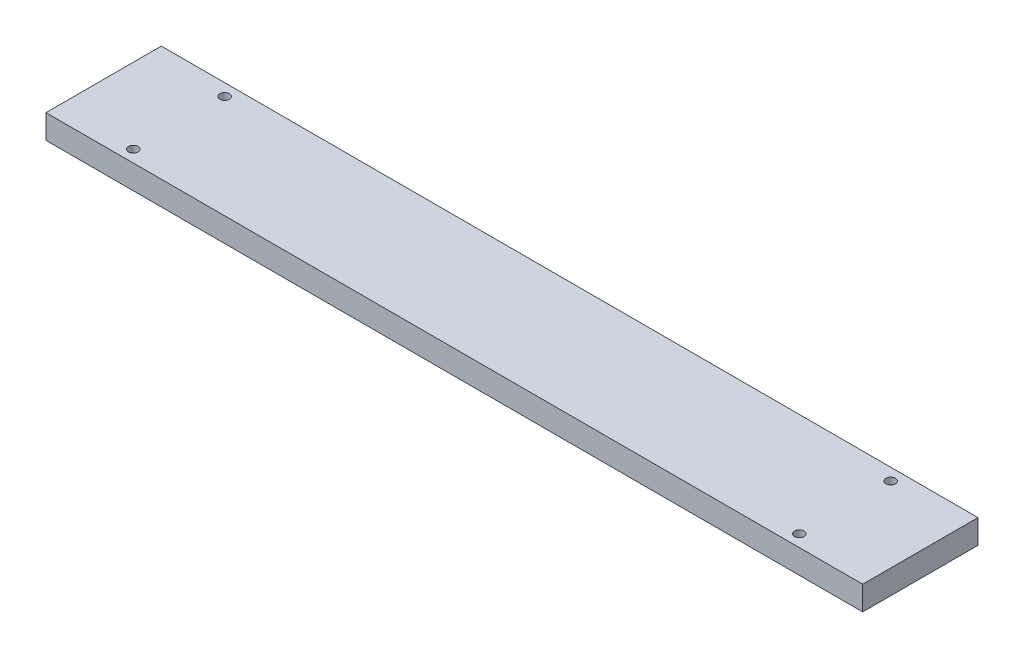
ISO-10303-21;
HEADER;
FILE_DESCRIPTION(('STEP AP214'),'2;1');
FILE_NAME('part.step','',(''),(''),'','','');
FILE_SCHEMA(('AUTOMOTIVE_DESIGN { 1 0 10303 214 1 1 1 1 }'));
ENDSEC;
DATA;
#1=APPLICATION_CONTEXT('core data for automotive mechanical design processes');
#2=APPLICATION_PROTOCOL_DEFINITION('international standard','automotive_design',2000,#1);
#3=PRODUCT_CONTEXT('',#1,'mechanical');
#4=PRODUCT('Part','Part','',(#3));
#5=PRODUCT_RELATED_PRODUCT_CATEGORY('part','',(#4));
#6=PRODUCT_DEFINITION_FORMATION('','',#4);
#7=PRODUCT_DEFINITION_CONTEXT('part definition',#1,'design');
#8=PRODUCT_DEFINITION('design','',#6,#7);
#9=PRODUCT_DEFINITION_SHAPE('','',#8);
#10=(LENGTH_UNIT() NAMED_UNIT(*) SI_UNIT(.MILLI.,.METRE.));
#11=(NAMED_UNIT(*) PLANE_ANGLE_UNIT() SI_UNIT($,.RADIAN.));
#12=(NAMED_UNIT(*) SI_UNIT($,.STERADIAN.) SOLID_ANGLE_UNIT());
#13=UNCERTAINTY_MEASURE_WITH_UNIT(LENGTH_MEASURE(1.E-05),#10,'distance_accuracy_value','');
#14=(GEOMETRIC_REPRESENTATION_CONTEXT(3) GLOBAL_UNCERTAINTY_ASSIGNED_CONTEXT((#13)) GLOBAL_UNIT_ASSIGNED_CONTEXT((#10,
#11,#12)) REPRESENTATION_CONTEXT('',''));
#15=CARTESIAN_POINT('',(0.,0.,0.));
#16=DIRECTION('',(0.,0.,1.));
#17=DIRECTION('',(1.,0.,0.));
#18=AXIS2_PLACEMENT_3D('',#15,#16,#17);
#19=CARTESIAN_POINT('',(425.,25.,-60.));
#20=DIRECTION('',(-1.,0.,0.));
#21=DIRECTION('',(0.,0.,1.));
#22=AXIS2_PLACEMENT_3D('',#19,#20,#21);
#23=PLANE('',#22);
#24=DIRECTION('',(0.,0.,-1.));
#25=VECTOR('',#24,1.);
#26=CARTESIAN_POINT('',(425.,0.,-60.));
#27=LINE('',#26,#25);
#28=CARTESIAN_POINT('',(425.,0.,60.));
#29=VERTEX_POINT('',#28);
#30=CARTESIAN_POINT('',(425.,0.,-60.));
#31=VERTEX_POINT('',#30);
#32=EDGE_CURVE('E107',#29,#31,#27,.T.);
#33=ORIENTED_EDGE('',*,*,#32,.T.);
#34=DIRECTION('',(0.,-1.,0.));
#35=VECTOR('',#34,1.);
#36=CARTESIAN_POINT('',(425.,25.,-60.));
#37=LINE('',#36,#35);
#38=CARTESIAN_POINT('',(425.,25.,-60.));
#39=VERTEX_POINT('',#38);
#40=EDGE_CURVE('E11',#39,#31,#37,.T.);
#41=ORIENTED_EDGE('',*,*,#40,.F.);
#42=DIRECTION('',(0.,0.,-1.));
#43=VECTOR('',#42,1.);
#44=CARTESIAN_POINT('',(425.,25.,-60.));
#45=LINE('',#44,#43);
#46=CARTESIAN_POINT('',(425.,25.,60.));
#47=VERTEX_POINT('',#46);
#48=EDGE_CURVE('E91',#47,#39,#45,.T.);
#49=ORIENTED_EDGE('',*,*,#48,.F.);
#50=DIRECTION('',(0.,-1.,0.));
#51=VECTOR('',#50,1.);
#52=CARTESIAN_POINT('',(425.,25.,60.));
#53=LINE('',#52,#51);
#54=EDGE_CURVE('E103',#47,#29,#53,.T.);
#55=ORIENTED_EDGE('',*,*,#54,.T.);
#56=EDGE_LOOP('',(#33,#41,#49,#55));
#57=FACE_BOUND('',#56,.T.);
#58=ADVANCED_FACE('F39',(#57),#23,.F.);
#59=CARTESIAN_POINT('',(-425.,25.,-60.));
#60=DIRECTION('',(0.,0.,1.));
#61=DIRECTION('',(1.,0.,0.));
#62=AXIS2_PLACEMENT_3D('',#59,#60,#61);
#63=PLANE('',#62);
#64=DIRECTION('',(-1.,0.,0.));
#65=VECTOR('',#64,1.);
#66=CARTESIAN_POINT('',(-425.,0.,-60.));
#67=LINE('',#66,#65);
#68=CARTESIAN_POINT('',(-425.,0.,-60.));
#69=VERTEX_POINT('',#68);
#70=EDGE_CURVE('E96',#31,#69,#67,.T.);
#71=ORIENTED_EDGE('',*,*,#70,.T.);
#72=DIRECTION('',(0.,-1.,0.));
#73=VECTOR('',#72,1.);
#74=CARTESIAN_POINT('',(-425.,25.,-60.));
#75=LINE('',#74,#73);
#76=CARTESIAN_POINT('',(-425.,25.,-60.));
#77=VERTEX_POINT('',#76);
#78=EDGE_CURVE('E48',#77,#69,#75,.T.);
#79=ORIENTED_EDGE('',*,*,#78,.F.);
#80=DIRECTION('',(-1.,0.,0.));
#81=VECTOR('',#80,1.);
#82=CARTESIAN_POINT('',(-425.,25.,-60.));
#83=LINE('',#82,#81);
#84=EDGE_CURVE('E86',#39,#77,#83,.T.);
#85=ORIENTED_EDGE('',*,*,#84,.F.);
#86=ORIENTED_EDGE('',*,*,#40,.T.);
#87=EDGE_LOOP('',(#71,#79,#85,#86));
#88=FACE_BOUND('',#87,.T.);
#89=ADVANCED_FACE('F95',(#88),#63,.F.);
#90=CARTESIAN_POINT('',(-425.,25.,-60.));
#91=DIRECTION('',(1.,0.,0.));
#92=DIRECTION('',(0.,0.,-1.));
#93=AXIS2_PLACEMENT_3D('',#90,#91,#92);
#94=PLANE('',#93);
#95=DIRECTION('',(0.,0.,1.));
#96=VECTOR('',#95,1.);
#97=CARTESIAN_POINT('',(-425.,0.,-60.));
#98=LINE('',#97,#96);
#99=CARTESIAN_POINT('',(-425.,0.,60.));
#100=VERTEX_POINT('',#99);
#101=EDGE_CURVE('E73',#69,#100,#98,.T.);
#102=ORIENTED_EDGE('',*,*,#101,.T.);
#103=DIRECTION('',(0.,-1.,0.));
#104=VECTOR('',#103,1.);
#105=CARTESIAN_POINT('',(-425.,25.,60.));
#106=LINE('',#105,#104);
#107=CARTESIAN_POINT('',(-425.,25.,60.));
#108=VERTEX_POINT('',#107);
#109=EDGE_CURVE('E98',#108,#100,#106,.T.);
#110=ORIENTED_EDGE('',*,*,#109,.F.);
#111=DIRECTION('',(0.,0.,1.));
#112=VECTOR('',#111,1.);
#113=CARTESIAN_POINT('',(-425.,25.,-60.));
#114=LINE('',#113,#112);
#115=EDGE_CURVE('E89',#77,#108,#114,.T.);
#116=ORIENTED_EDGE('',*,*,#115,.F.);
#117=ORIENTED_EDGE('',*,*,#78,.T.);
#118=EDGE_LOOP('',(#102,#110,#116,#117));
#119=FACE_BOUND('',#118,.T.);
#120=ADVANCED_FACE('F99',(#119),#94,.F.);
#121=CARTESIAN_POINT('',(-425.,25.,60.));
#122=DIRECTION('',(0.,0.,-1.));
#123=DIRECTION('',(-1.,0.,0.));
#124=AXIS2_PLACEMENT_3D('',#121,#122,#123);
#125=PLANE('',#124);
#126=DIRECTION('',(1.,0.,0.));
#127=VECTOR('',#126,1.);
#128=CARTESIAN_POINT('',(-425.,0.,60.));
#129=LINE('',#128,#127);
#130=EDGE_CURVE('E79',#100,#29,#129,.T.);
#131=ORIENTED_EDGE('',*,*,#130,.T.);
#132=ORIENTED_EDGE('',*,*,#54,.F.);
#133=DIRECTION('',(1.,0.,0.));
#134=VECTOR('',#133,1.);
#135=CARTESIAN_POINT('',(-425.,25.,60.));
#136=LINE('',#135,#134);
#137=EDGE_CURVE('E56',#108,#47,#136,.T.);
#138=ORIENTED_EDGE('',*,*,#137,.F.);
#139=ORIENTED_EDGE('',*,*,#109,.T.);
#140=EDGE_LOOP('',(#131,#132,#138,#139));
#141=FACE_BOUND('',#140,.T.);
#142=ADVANCED_FACE('F121',(#141),#125,.F.);
#143=CARTESIAN_POINT('',(0.,25.,0.));
#144=DIRECTION('',(0.,1.,0.));
#145=DIRECTION('',(0.,0.,1.));
#146=AXIS2_PLACEMENT_3D('',#143,#144,#145);
#147=PLANE('',#146);
#148=CARTESIAN_POINT('',(346.616822539223,25.,-47.5));
#149=DIRECTION('',(0.,1.,0.));
#150=DIRECTION('',(0.,0.,-1.));
#151=AXIS2_PLACEMENT_3D('',#148,#149,#150);
#152=CIRCLE('',#151,4.99999999999999);
#153=CARTESIAN_POINT('',(346.616822539223,25.,-52.5));
#154=VERTEX_POINT('',#153);
#155=EDGE_CURVE('E136',#154,#154,#152,.T.);
#156=ORIENTED_EDGE('',*,*,#155,.F.);
#157=EDGE_LOOP('',(#156));
#158=FACE_BOUND('',#157,.T.);
#159=CARTESIAN_POINT('',(346.616822539223,25.,47.5));
#160=DIRECTION('',(0.,1.,0.));
#161=DIRECTION('',(0.,0.,-1.));
#162=AXIS2_PLACEMENT_3D('',#159,#160,#161);
#163=CIRCLE('',#162,4.99999999999999);
#164=CARTESIAN_POINT('',(346.616822539223,25.,42.5));
#165=VERTEX_POINT('',#164);
#166=EDGE_CURVE('E144',#165,#165,#163,.T.);
#167=ORIENTED_EDGE('',*,*,#166,.F.);
#168=EDGE_LOOP('',(#167));
#169=FACE_BOUND('',#168,.T.);
#170=CARTESIAN_POINT('',(-346.616822539223,25.,47.5));
#171=DIRECTION('',(0.,1.,0.));
#172=DIRECTION('',(0.,0.,1.));
#173=AXIS2_PLACEMENT_3D('',#170,#171,#172);
#174=CIRCLE('',#173,4.99999999999999);
#175=CARTESIAN_POINT('',(-346.616822539223,25.,52.5));
#176=VERTEX_POINT('',#175);
#177=EDGE_CURVE('E152',#176,#176,#174,.T.);
#178=ORIENTED_EDGE('',*,*,#177,.F.);
#179=EDGE_LOOP('',(#178));
#180=FACE_BOUND('',#179,.T.);
#181=CARTESIAN_POINT('',(-346.616822539223,25.,-47.5));
#182=DIRECTION('',(0.,1.,0.));
#183=DIRECTION('',(0.,0.,1.));
#184=AXIS2_PLACEMENT_3D('',#181,#182,#183);
#185=CIRCLE('',#184,4.99999999999999);
#186=CARTESIAN_POINT('',(-346.616822539223,25.,-42.5));
#187=VERTEX_POINT('',#186);
#188=EDGE_CURVE('E128',#187,#187,#185,.T.);
#189=ORIENTED_EDGE('',*,*,#188,.F.);
#190=EDGE_LOOP('',(#189));
#191=FACE_BOUND('',#190,.T.);
#192=ORIENTED_EDGE('',*,*,#48,.T.);
#193=ORIENTED_EDGE('',*,*,#84,.T.);
#194=ORIENTED_EDGE('',*,*,#115,.T.);
#195=ORIENTED_EDGE('',*,*,#137,.T.);
#196=EDGE_LOOP('',(#192,#193,#194,#195));
#197=FACE_BOUND('',#196,.T.);
#198=ADVANCED_FACE('F87',(#158,#169,#180,#191,#197),#147,.T.);
#199=CARTESIAN_POINT('',(0.,0.,0.));
#200=DIRECTION('',(0.,1.,0.));
#201=DIRECTION('',(0.,0.,1.));
#202=AXIS2_PLACEMENT_3D('',#199,#200,#201);
#203=PLANE('',#202);
#204=CARTESIAN_POINT('',(346.616822539223,0.,-47.5));
#205=DIRECTION('',(0.,1.,0.));
#206=DIRECTION('',(0.,0.,-1.));
#207=AXIS2_PLACEMENT_3D('',#204,#205,#206);
#208=CIRCLE('',#207,4.99999999999999);
#209=CARTESIAN_POINT('',(346.616822539223,0.,-52.5));
#210=VERTEX_POINT('',#209);
#211=EDGE_CURVE('E140',#210,#210,#208,.T.);
#212=ORIENTED_EDGE('',*,*,#211,.T.);
#213=EDGE_LOOP('',(#212));
#214=FACE_BOUND('',#213,.T.);
#215=CARTESIAN_POINT('',(346.616822539223,0.,47.5));
#216=DIRECTION('',(0.,1.,0.));
#217=DIRECTION('',(0.,0.,-1.));
#218=AXIS2_PLACEMENT_3D('',#215,#216,#217);
#219=CIRCLE('',#218,4.99999999999999);
#220=CARTESIAN_POINT('',(346.616822539223,0.,42.5));
#221=VERTEX_POINT('',#220);
#222=EDGE_CURVE('E148',#221,#221,#219,.T.);
#223=ORIENTED_EDGE('',*,*,#222,.T.);
#224=EDGE_LOOP('',(#223));
#225=FACE_BOUND('',#224,.T.);
#226=CARTESIAN_POINT('',(-346.616822539223,0.,47.5));
#227=DIRECTION('',(0.,1.,0.));
#228=DIRECTION('',(0.,0.,1.));
#229=AXIS2_PLACEMENT_3D('',#226,#227,#228);
#230=CIRCLE('',#229,4.99999999999999);
#231=CARTESIAN_POINT('',(-346.616822539223,0.,52.5));
#232=VERTEX_POINT('',#231);
#233=EDGE_CURVE('E132',#232,#232,#230,.T.);
#234=ORIENTED_EDGE('',*,*,#233,.T.);
#235=EDGE_LOOP('',(#234));
#236=FACE_BOUND('',#235,.T.);
#237=CARTESIAN_POINT('',(-346.616822539223,0.,-47.5));
#238=DIRECTION('',(0.,1.,0.));
#239=DIRECTION('',(0.,0.,1.));
#240=AXIS2_PLACEMENT_3D('',#237,#238,#239);
#241=CIRCLE('',#240,4.99999999999999);
#242=CARTESIAN_POINT('',(-346.616822539223,0.,-42.5));
#243=VERTEX_POINT('',#242);
#244=EDGE_CURVE('E111',#243,#243,#241,.T.);
#245=ORIENTED_EDGE('',*,*,#244,.T.);
#246=EDGE_LOOP('',(#245));
#247=FACE_BOUND('',#246,.T.);
#248=ORIENTED_EDGE('',*,*,#32,.F.);
#249=ORIENTED_EDGE('',*,*,#130,.F.);
#250=ORIENTED_EDGE('',*,*,#101,.F.);
#251=ORIENTED_EDGE('',*,*,#70,.F.);
#252=EDGE_LOOP('',(#248,#249,#250,#251));
#253=FACE_BOUND('',#252,.T.);
#254=ADVANCED_FACE('F124',(#214,#225,#236,#247,#253),#203,.F.);
#255=CARTESIAN_POINT('',(-346.616822539223,0.,-47.5));
#256=DIRECTION('',(0.,1.,0.));
#257=DIRECTION('',(0.,0.,1.));
#258=AXIS2_PLACEMENT_3D('',#255,#256,#257);
#259=CYLINDRICAL_SURFACE('',#258,4.99999999999999);
#260=ORIENTED_EDGE('',*,*,#244,.F.);
#261=EDGE_LOOP('',(#260));
#262=FACE_BOUND('',#261,.T.);
#263=ORIENTED_EDGE('',*,*,#188,.T.);
#264=EDGE_LOOP('',(#263));
#265=FACE_BOUND('',#264,.T.);
#266=ADVANCED_FACE('F166',(#262,#265),#259,.F.);
#267=CARTESIAN_POINT('',(-346.616822539223,0.,47.5));
#268=DIRECTION('',(0.,1.,0.));
#269=DIRECTION('',(0.,0.,1.));
#270=AXIS2_PLACEMENT_3D('',#267,#268,#269);
#271=CYLINDRICAL_SURFACE('',#270,4.99999999999999);
#272=ORIENTED_EDGE('',*,*,#233,.F.);
#273=EDGE_LOOP('',(#272));
#274=FACE_BOUND('',#273,.T.);
#275=ORIENTED_EDGE('',*,*,#177,.T.);
#276=EDGE_LOOP('',(#275));
#277=FACE_BOUND('',#276,.T.);
#278=ADVANCED_FACE('F162',(#274,#277),#271,.F.);
#279=CARTESIAN_POINT('',(346.616822539223,0.,47.5));
#280=DIRECTION('',(0.,1.,0.));
#281=DIRECTION('',(0.,0.,1.));
#282=AXIS2_PLACEMENT_3D('',#279,#280,#281);
#283=CYLINDRICAL_SURFACE('',#282,4.99999999999999);
#284=ORIENTED_EDGE('',*,*,#222,.F.);
#285=EDGE_LOOP('',(#284));
#286=FACE_BOUND('',#285,.T.);
#287=ORIENTED_EDGE('',*,*,#166,.T.);
#288=EDGE_LOOP('',(#287));
#289=FACE_BOUND('',#288,.T.);
#290=ADVANCED_FACE('F165',(#286,#289),#283,.F.);
#291=CARTESIAN_POINT('',(346.616822539223,0.,-47.5));
#292=DIRECTION('',(0.,1.,0.));
#293=DIRECTION('',(0.,0.,1.));
#294=AXIS2_PLACEMENT_3D('',#291,#292,#293);
#295=CYLINDRICAL_SURFACE('',#294,4.99999999999999);
#296=ORIENTED_EDGE('',*,*,#211,.F.);
#297=EDGE_LOOP('',(#296));
#298=FACE_BOUND('',#297,.T.);
#299=ORIENTED_EDGE('',*,*,#155,.T.);
#300=EDGE_LOOP('',(#299));
#301=FACE_BOUND('',#300,.T.);
#302=ADVANCED_FACE('F227',(#298,#301),#295,.F.);
#303=CLOSED_SHELL('',(#58,#89,#120,#142,#198,#254,#266,#278,#290,#302));
#304=MANIFOLD_SOLID_BREP('B2',#303);
#305=ADVANCED_BREP_SHAPE_REPRESENTATION('',(#18,#304),#14);
#306=SHAPE_DEFINITION_REPRESENTATION(#9,#305);
ENDSEC;
END-ISO-10303-21;
